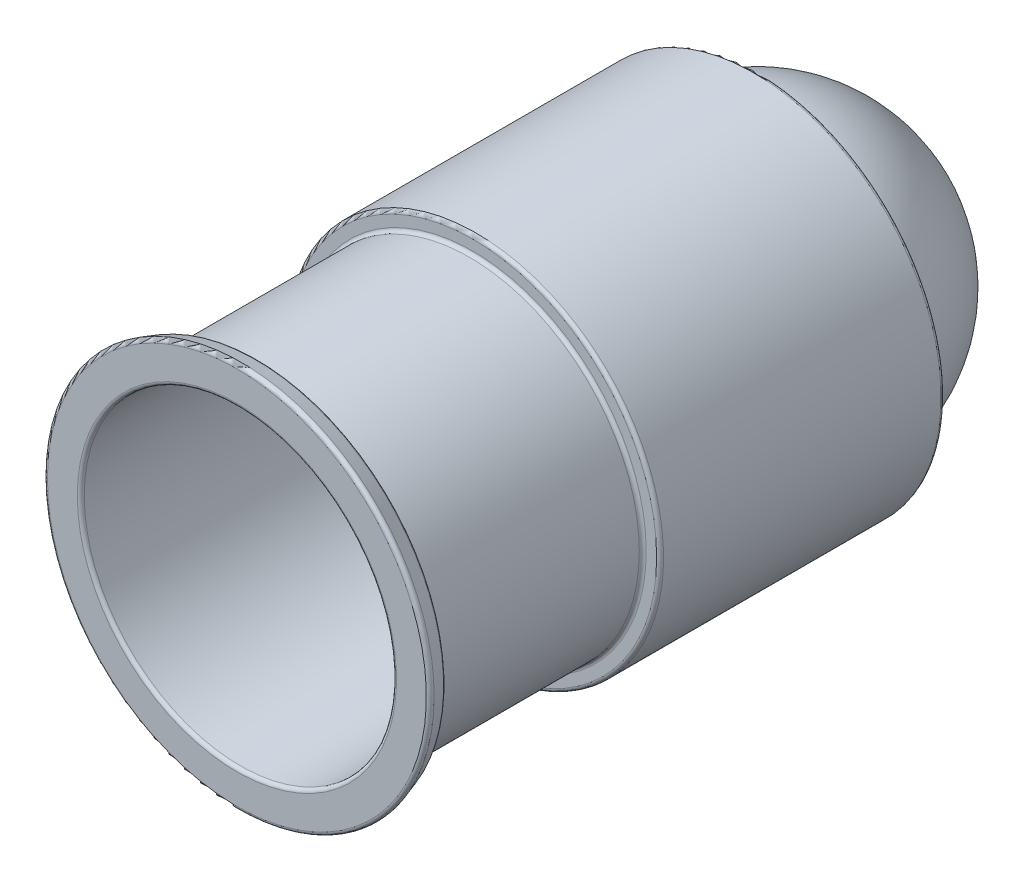
ISO-10303-21;
HEADER;
FILE_DESCRIPTION(('STEP AP214'),'2;1');
FILE_NAME('part.step','',(''),(''),'','','');
FILE_SCHEMA(('AUTOMOTIVE_DESIGN { 1 0 10303 214 1 1 1 1 }'));
ENDSEC;
DATA;
#1=APPLICATION_CONTEXT('core data for automotive mechanical design processes');
#2=APPLICATION_PROTOCOL_DEFINITION('international standard','automotive_design',2000,#1);
#3=PRODUCT_CONTEXT('',#1,'mechanical');
#4=PRODUCT('Part','Part','',(#3));
#5=PRODUCT_RELATED_PRODUCT_CATEGORY('part','',(#4));
#6=PRODUCT_DEFINITION_FORMATION('','',#4);
#7=PRODUCT_DEFINITION_CONTEXT('part definition',#1,'design');
#8=PRODUCT_DEFINITION('design','',#6,#7);
#9=PRODUCT_DEFINITION_SHAPE('','',#8);
#10=(LENGTH_UNIT() NAMED_UNIT(*) SI_UNIT(.MILLI.,.METRE.));
#11=(NAMED_UNIT(*) PLANE_ANGLE_UNIT() SI_UNIT($,.RADIAN.));
#12=(NAMED_UNIT(*) SI_UNIT($,.STERADIAN.) SOLID_ANGLE_UNIT());
#13=UNCERTAINTY_MEASURE_WITH_UNIT(LENGTH_MEASURE(1.E-05),#10,'distance_accuracy_value','');
#14=(GEOMETRIC_REPRESENTATION_CONTEXT(3) GLOBAL_UNCERTAINTY_ASSIGNED_CONTEXT((#13)) GLOBAL_UNIT_ASSIGNED_CONTEXT((#10,
#11,#12)) REPRESENTATION_CONTEXT('',''));
#15=CARTESIAN_POINT('',(0.,0.,0.));
#16=DIRECTION('',(0.,0.,1.));
#17=DIRECTION('',(1.,0.,0.));
#18=AXIS2_PLACEMENT_3D('',#15,#16,#17);
#19=CARTESIAN_POINT('',(27.,0.,-0.5));
#20=DIRECTION('',(0.,0.,-1.));
#21=DIRECTION('',(-1.,0.,0.));
#22=AXIS2_PLACEMENT_3D('',#19,#20,#21);
#23=TOROIDAL_SURFACE('',#22,23.,0.5);
#24=CARTESIAN_POINT('',(27.,0.,-0.5));
#25=DIRECTION('',(0.,0.,-1.));
#26=DIRECTION('',(-1.,0.,0.));
#27=AXIS2_PLACEMENT_3D('',#24,#25,#26);
#28=CIRCLE('',#27,22.5);
#29=CARTESIAN_POINT('',(4.50000000000001,0.,-0.5));
#30=VERTEX_POINT('',#29);
#31=EDGE_CURVE('E10',#30,#30,#28,.T.);
#32=ORIENTED_EDGE('',*,*,#31,.T.);
#33=EDGE_LOOP('',(#32));
#34=FACE_BOUND('',#33,.T.);
#35=CARTESIAN_POINT('',(27.,0.,0.));
#36=DIRECTION('',(0.,0.,-1.));
#37=DIRECTION('',(-1.,0.,0.));
#38=AXIS2_PLACEMENT_3D('',#35,#36,#37);
#39=CIRCLE('',#38,23.);
#40=CARTESIAN_POINT('',(4.00000000000001,0.,0.));
#41=VERTEX_POINT('',#40);
#42=EDGE_CURVE('E106',#41,#41,#39,.T.);
#43=ORIENTED_EDGE('',*,*,#42,.F.);
#44=EDGE_LOOP('',(#43));
#45=FACE_BOUND('',#44,.T.);
#46=ADVANCED_FACE('F30',(#34,#45),#23,.T.);
#47=CARTESIAN_POINT('',(27.,0.,-75.));
#48=DIRECTION('',(0.,0.,-1.));
#49=DIRECTION('',(-1.,0.,0.));
#50=AXIS2_PLACEMENT_3D('',#47,#48,#49);
#51=CYLINDRICAL_SURFACE('',#50,22.5);
#52=CARTESIAN_POINT('',(27.,0.,-72.));
#53=DIRECTION('',(0.,0.,-1.));
#54=DIRECTION('',(-1.,0.,0.));
#55=AXIS2_PLACEMENT_3D('',#52,#53,#54);
#56=CIRCLE('',#55,22.5);
#57=CARTESIAN_POINT('',(4.5,0.,-72.));
#58=VERTEX_POINT('',#57);
#59=EDGE_CURVE('E36',#58,#58,#56,.T.);
#60=ORIENTED_EDGE('',*,*,#59,.T.);
#61=EDGE_LOOP('',(#60));
#62=FACE_BOUND('',#61,.T.);
#63=ORIENTED_EDGE('',*,*,#31,.F.);
#64=EDGE_LOOP('',(#63));
#65=FACE_BOUND('',#64,.T.);
#66=ADVANCED_FACE('F114',(#62,#65),#51,.F.);
#67=CARTESIAN_POINT('',(27.,0.,-72.));
#68=DIRECTION('',(0.,0.,-1.));
#69=DIRECTION('',(-1.,0.,0.));
#70=AXIS2_PLACEMENT_3D('',#67,#68,#69);
#71=TOROIDAL_SURFACE('',#70,22.,0.5);
#72=CARTESIAN_POINT('',(27.,0.,-72.5));
#73=DIRECTION('',(0.,0.,-1.));
#74=DIRECTION('',(-1.,0.,0.));
#75=AXIS2_PLACEMENT_3D('',#72,#73,#74);
#76=CIRCLE('',#75,22.);
#77=CARTESIAN_POINT('',(5.,0.,-72.5));
#78=VERTEX_POINT('',#77);
#79=EDGE_CURVE('E40',#78,#78,#76,.T.);
#80=ORIENTED_EDGE('',*,*,#79,.T.);
#81=EDGE_LOOP('',(#80));
#82=FACE_BOUND('',#81,.T.);
#83=ORIENTED_EDGE('',*,*,#59,.F.);
#84=EDGE_LOOP('',(#83));
#85=FACE_BOUND('',#84,.T.);
#86=ADVANCED_FACE('F118',(#82,#85),#71,.F.);
#87=CARTESIAN_POINT('',(5.,0.,-72.5));
#88=DIRECTION('',(0.,0.,1.));
#89=DIRECTION('',(1.,0.,0.));
#90=AXIS2_PLACEMENT_3D('',#87,#88,#89);
#91=PLANE('',#90);
#92=CARTESIAN_POINT('',(27.,0.,-72.5));
#93=DIRECTION('',(0.,0.,-1.));
#94=DIRECTION('',(-1.,0.,0.));
#95=AXIS2_PLACEMENT_3D('',#92,#93,#94);
#96=CIRCLE('',#95,20.4022057631032);
#97=CARTESIAN_POINT('',(6.59779423689683,0.,-72.5));
#98=VERTEX_POINT('',#97);
#99=EDGE_CURVE('E44',#98,#98,#96,.T.);
#100=ORIENTED_EDGE('',*,*,#99,.T.);
#101=EDGE_LOOP('',(#100));
#102=FACE_BOUND('',#101,.T.);
#103=ORIENTED_EDGE('',*,*,#79,.F.);
#104=EDGE_LOOP('',(#103));
#105=FACE_BOUND('',#104,.T.);
#106=ADVANCED_FACE('F122',(#102,#105),#91,.T.);
#107=CARTESIAN_POINT('',(27.,0.,-73.));
#108=DIRECTION('',(0.,0.,-1.));
#109=DIRECTION('',(-1.,0.,0.));
#110=AXIS2_PLACEMENT_3D('',#107,#108,#109);
#111=TOROIDAL_SURFACE('',#110,20.4022057631032,0.499999999999999);
#112=CARTESIAN_POINT('',(27.,0.,-73.0487804878049));
#113=DIRECTION('',(0.,0.,-1.));
#114=DIRECTION('',(-1.,0.,0.));
#115=AXIS2_PLACEMENT_3D('',#112,#113,#114);
#116=CIRCLE('',#115,19.9045909883933);
#117=CARTESIAN_POINT('',(7.09540901160666,0.,-73.0487804878049));
#118=VERTEX_POINT('',#117);
#119=EDGE_CURVE('E49',#118,#118,#116,.T.);
#120=ORIENTED_EDGE('',*,*,#119,.T.);
#121=EDGE_LOOP('',(#120));
#122=FACE_BOUND('',#121,.T.);
#123=ORIENTED_EDGE('',*,*,#99,.F.);
#124=EDGE_LOOP('',(#123));
#125=FACE_BOUND('',#124,.T.);
#126=ADVANCED_FACE('F129',(#122,#125),#111,.T.);
#127=CARTESIAN_POINT('',(27.,0.,-75.));
#128=DIRECTION('',(0.,0.,-1.));
#129=DIRECTION('',(-1.,0.,0.));
#130=AXIS2_PLACEMENT_3D('',#127,#128,#129);
#131=SPHERICAL_SURFACE('',#130,20.);
#132=CARTESIAN_POINT('',(27.,0.,-90.8517822529482));
#133=DIRECTION('',(0.,0.,-1.));
#134=DIRECTION('',(-1.,0.,0.));
#135=AXIS2_PLACEMENT_3D('',#132,#133,#134);
#136=CIRCLE('',#135,12.1951219512195);
#137=CARTESIAN_POINT('',(14.8048780487805,0.,-90.8517822529482));
#138=VERTEX_POINT('',#137);
#139=EDGE_CURVE('E52',#138,#138,#136,.T.);
#140=CARTESIAN_POINT('',(14.8048780487805,0.,-90.8517822529482));
#141=CARTESIAN_POINT('',(14.6376476046658,0.,-90.7231297380726));
#142=CARTESIAN_POINT('',(14.4724545105892,0.,-90.5918290895563));
#143=CARTESIAN_POINT('',(14.1463051265668,0.,-90.324067107118));
#144=CARTESIAN_POINT('',(13.985348836621,0.,-90.1876057731961));
#145=CARTESIAN_POINT('',(13.667835164915,0.,-89.909658001823));
#146=CARTESIAN_POINT('',(13.5112777831548,0.,-89.7681715643718));
#147=CARTESIAN_POINT('',(13.2027184890873,0.,-89.4803155857149));
#148=CARTESIAN_POINT('',(13.0507165767801,0.,-89.3339460445091));
#149=CARTESIAN_POINT('',(12.7514205249749,0.,-89.0364703777392));
#150=CARTESIAN_POINT('',(12.604126385477,0.,-88.8853642521749));
#151=CARTESIAN_POINT('',(12.3143933858978,0.,-88.5785667794907));
#152=CARTESIAN_POINT('',(12.1719545258165,0.,-88.4228754323708));
#153=CARTESIAN_POINT('',(11.8920747506997,0.,-88.1070634451072));
#154=CARTESIAN_POINT('',(11.7546338356642,0.,-87.9469428049635));
#155=CARTESIAN_POINT('',(11.4848876046675,0.,-87.6224326035244));
#156=CARTESIAN_POINT('',(11.3525822887063,0.,-87.4580430422289));
#157=CARTESIAN_POINT('',(11.0932397678485,0.,-87.1251596440241));
#158=CARTESIAN_POINT('',(10.966202562952,0.,-86.9566658071148));
#159=CARTESIAN_POINT('',(10.7175234994659,0.,-86.6157426144095));
#160=CARTESIAN_POINT('',(10.5958816408764,0.,-86.4433132586135));
#161=CARTESIAN_POINT('',(10.3581151015987,0.,-86.0946917263814));
#162=CARTESIAN_POINT('',(10.2419904209105,0.,-85.9184995499452));
#163=CARTESIAN_POINT('',(10.0153745432172,0.,-85.5625288434051));
#164=CARTESIAN_POINT('',(9.90488334621196,0.,-85.3827503133012));
#165=CARTESIAN_POINT('',(9.68964509940458,0.,-85.0197869583351));
#166=CARTESIAN_POINT('',(9.58489804960242,0.,-84.8366021334729));
#167=CARTESIAN_POINT('',(9.38125300761332,0.,-84.4670096595096));
#168=CARTESIAN_POINT('',(9.28235501542638,0.,-84.2806020104084));
#169=CARTESIAN_POINT('',(9.09050714090073,0.,-83.9047505863363));
#170=CARTESIAN_POINT('',(8.99755725856201,0.,-83.7153068113654));
#171=CARTESIAN_POINT('',(8.81769869857916,0.,-83.3335728747839));
#172=CARTESIAN_POINT('',(8.73079002093502,0.,-83.1412827131735));
#173=CARTESIAN_POINT('',(8.5631009145612,0.,-82.7540485933692));
#174=CARTESIAN_POINT('',(8.48232048583152,0.,-82.5591046351753));
#175=CARTESIAN_POINT('',(8.32696878369997,0.,-82.1667581701959));
#176=CARTESIAN_POINT('',(8.2523975102981,0.,-81.9693556634102));
#177=CARTESIAN_POINT('',(8.10953880639653,0.,-81.5722898116216));
#178=CARTESIAN_POINT('',(8.04125137589682,0.,-81.3726264666187));
#179=CARTESIAN_POINT('',(7.91102875173051,0.,-80.9712389131341));
#180=CARTESIAN_POINT('',(7.84909355806391,0.,-80.7695147046525));
#181=CARTESIAN_POINT('',(7.73163743935194,0.,-80.364207463027));
#182=CARTESIAN_POINT('',(7.67611651430657,0.,-80.1606244298831));
#183=CARTESIAN_POINT('',(7.5715445403495,0.,-79.7518034394727));
#184=CARTESIAN_POINT('',(7.5224934914378,0.,-79.5465654822062));
#185=CARTESIAN_POINT('',(7.43091039730674,0.,-79.1346402015966));
#186=CARTESIAN_POINT('',(7.38837835208737,0.,-78.9279528782534));
#187=CARTESIAN_POINT('',(7.30987586368142,0.,-78.5133358751593));
#188=CARTESIAN_POINT('',(7.27390542049484,0.,-78.3054061954084));
#189=CARTESIAN_POINT('',(7.20856216283677,0.,-77.8885127334737));
#190=CARTESIAN_POINT('',(7.17918934836528,0.,-77.67954895129));
#191=CARTESIAN_POINT('',(7.12707076623962,0.,-77.2607965741359));
#192=CARTESIAN_POINT('',(7.10432499858546,0.,-77.0510079791655));
#193=CARTESIAN_POINT('',(7.06548329328399,0.,-76.630816092347));
#194=CARTESIAN_POINT('',(7.04938735563668,0.,-76.4204128004988));
#195=CARTESIAN_POINT('',(7.0238614241207,0.,-75.9992022508793));
#196=CARTESIAN_POINT('',(7.01443143025203,0.,-75.7883949931078));
#197=CARTESIAN_POINT('',(7.0022468581224,0.,-75.3665876494681));
#198=CARTESIAN_POINT('',(6.99949227986144,0.,-75.1555875635998));
#199=CARTESIAN_POINT('',(7.00066119657751,0.,-74.7336058862278));
#200=CARTESIAN_POINT('',(7.00458469155454,0.,-74.5226242947242));
#201=CARTESIAN_POINT('',(7.01910620298032,0.,-74.1008909417185));
#202=CARTESIAN_POINT('',(7.02970421942908,0.,-73.8901391802165));
#203=CARTESIAN_POINT('',(7.05756274910619,0.,-73.4690764743617));
#204=CARTESIAN_POINT('',(7.07482326233455,0.,-73.2587655300091));
#205=CARTESIAN_POINT('',(7.09540901160666,0.,-73.0487804878049));
#206=B_SPLINE_CURVE_WITH_KNOTS('',3,(#140,#141,#142,#143,#144,#145,#146,#147,#148,#149,#150,
#151,#152,#153,#154,#155,#156,#157,#158,#159,#160,#161,#162,#163,#164,#165,#166,#167,#168,#169,
#170,#171,#172,#173,#174,#175,#176,#177,#178,#179,#180,#181,#182,#183,#184,#185,#186,#187,#188,
#189,#190,#191,#192,#193,#194,#195,#196,#197,#198,#199,#200,#201,#202,#203,#204,#205),
.UNSPECIFIED.,.F.,.F.,(4,2,2,2,2,2,2,2,2,2,2,2,2,2,2,2,2,2,2,2,2,2,2,2,2,2,2,2,2,2,2,2,4),(0.,
0.632948526716031,1.26589705343205,1.89884558014808,2.53179410686412,3.16474263358014,
3.79769116029617,4.4306396870122,5.06358821372822,5.69653674044425,6.32948526716028,
6.96243379387631,7.59538232059234,8.22833084730836,8.86127937402438,9.49422790074041,
10.1271764274564,10.7601249541725,11.3930734808885,12.0260220076045,12.6589705343205,
13.2919190610366,13.9248675877526,14.5578161144686,15.1907646411847,15.8237131679007,
16.4566616946167,17.0896102213327,17.7225587480488,18.3555072747648,18.9884558014808,
19.6214043281969,20.2543528549129),.UNSPECIFIED.);
#207=EDGE_CURVE('BSEAM133',#138,#118,#206,.T.);
#208=ORIENTED_EDGE('',*,*,#139,.T.);
#209=ORIENTED_EDGE('',*,*,#119,.F.);
#210=ORIENTED_EDGE('',*,*,#207,.T.);
#211=ORIENTED_EDGE('',*,*,#207,.F.);
#212=EDGE_LOOP('',(#208,#210,#209,#211));
#213=FACE_BOUND('',#212,.T.);
#214=ADVANCED_FACE('F133',(#213),#131,.F.);
#215=CARTESIAN_POINT('',(27.,0.,-91.2480768092719));
#216=DIRECTION('',(0.,0.,-1.));
#217=DIRECTION('',(-1.,0.,0.));
#218=AXIS2_PLACEMENT_3D('',#215,#216,#217);
#219=TOROIDAL_SURFACE('',#218,12.5,0.499999999999997);
#220=CARTESIAN_POINT('',(27.,0.,-91.2480768092719));
#221=DIRECTION('',(0.,0.,-1.));
#222=DIRECTION('',(-1.,0.,0.));
#223=AXIS2_PLACEMENT_3D('',#220,#221,#222);
#224=CIRCLE('',#223,12.);
#225=CARTESIAN_POINT('',(15.,0.,-91.2480768092719));
#226=VERTEX_POINT('',#225);
#227=EDGE_CURVE('E55',#226,#226,#224,.T.);
#228=ORIENTED_EDGE('',*,*,#227,.T.);
#229=EDGE_LOOP('',(#228));
#230=FACE_BOUND('',#229,.T.);
#231=ORIENTED_EDGE('',*,*,#139,.F.);
#232=EDGE_LOOP('',(#231));
#233=FACE_BOUND('',#232,.T.);
#234=ADVANCED_FACE('F137',(#230,#233),#219,.T.);
#235=CARTESIAN_POINT('',(27.,0.,-75.));
#236=DIRECTION('',(0.,0.,-1.));
#237=DIRECTION('',(-1.,0.,0.));
#238=AXIS2_PLACEMENT_3D('',#235,#236,#237);
#239=CYLINDRICAL_SURFACE('',#238,12.);
#240=CARTESIAN_POINT('',(27.,0.,-93.1038669902317));
#241=DIRECTION('',(0.,0.,-1.));
#242=DIRECTION('',(-1.,0.,0.));
#243=AXIS2_PLACEMENT_3D('',#240,#241,#242);
#244=CIRCLE('',#243,12.);
#245=CARTESIAN_POINT('',(15.,0.,-93.1038669902317));
#246=VERTEX_POINT('',#245);
#247=EDGE_CURVE('E58',#246,#246,#244,.T.);
#248=ORIENTED_EDGE('',*,*,#247,.T.);
#249=EDGE_LOOP('',(#248));
#250=FACE_BOUND('',#249,.T.);
#251=ORIENTED_EDGE('',*,*,#227,.F.);
#252=EDGE_LOOP('',(#251));
#253=FACE_BOUND('',#252,.T.);
#254=ADVANCED_FACE('F141',(#250,#253),#239,.F.);
#255=CARTESIAN_POINT('',(27.,0.,-93.1038669902317));
#256=DIRECTION('',(0.,0.,-1.));
#257=DIRECTION('',(-1.,0.,0.));
#258=AXIS2_PLACEMENT_3D('',#255,#256,#257);
#259=TOROIDAL_SURFACE('',#258,12.5,0.500000000000001);
#260=CARTESIAN_POINT('',(27.,0.,-93.515318512737));
#261=DIRECTION('',(0.,0.,-1.));
#262=DIRECTION('',(-1.,0.,0.));
#263=AXIS2_PLACEMENT_3D('',#260,#261,#262);
#264=CIRCLE('',#263,12.7840909090909);
#265=CARTESIAN_POINT('',(14.2159090909091,0.,-93.515318512737));
#266=VERTEX_POINT('',#265);
#267=EDGE_CURVE('E61',#266,#266,#264,.T.);
#268=ORIENTED_EDGE('',*,*,#267,.T.);
#269=EDGE_LOOP('',(#268));
#270=FACE_BOUND('',#269,.T.);
#271=ORIENTED_EDGE('',*,*,#247,.F.);
#272=EDGE_LOOP('',(#271));
#273=FACE_BOUND('',#272,.T.);
#274=ADVANCED_FACE('F145',(#270,#273),#259,.T.);
#275=CARTESIAN_POINT('',(27.,0.,-75.));
#276=DIRECTION('',(0.,0.,-1.));
#277=DIRECTION('',(-1.,0.,0.));
#278=AXIS2_PLACEMENT_3D('',#275,#276,#277);
#279=SPHERICAL_SURFACE('',#278,22.5);
#280=CARTESIAN_POINT('',(27.,0.,-75.4891304347826));
#281=DIRECTION('',(0.,0.,-1.));
#282=DIRECTION('',(-1.,0.,0.));
#283=AXIS2_PLACEMENT_3D('',#280,#281,#282);
#284=CIRCLE('',#283,22.494682736544);
#285=CARTESIAN_POINT('',(4.50531726345602,0.,-75.4891304347826));
#286=VERTEX_POINT('',#285);
#287=EDGE_CURVE('E64',#286,#286,#284,.T.);
#288=CARTESIAN_POINT('',(4.50531726345602,0.,-75.4891304347826));
#289=CARTESIAN_POINT('',(4.51012990051532,0.,-75.7105064680877));
#290=CARTESIAN_POINT('',(4.51821247214517,0.,-75.9318113467285));
#291=CARTESIAN_POINT('',(4.54090595227022,0.,-76.3740861378272));
#292=CARTESIAN_POINT('',(4.55551686076542,0.,-76.5950560502851));
#293=CARTESIAN_POINT('',(4.59125548234546,0.,-77.0364682521639));
#294=CARTESIAN_POINT('',(4.61238319543029,0.,-77.2569105415847));
#295=CARTESIAN_POINT('',(4.66113668929271,0.,-77.6970753786347));
#296=CARTESIAN_POINT('',(4.68876247007028,0.,-77.9167979262638));
#297=CARTESIAN_POINT('',(4.7504881072967,0.,-78.3553317673341));
#298=CARTESIAN_POINT('',(4.78458796374554,0.,-78.5741430607752));
#299=CARTESIAN_POINT('',(4.85923200808944,0.,-79.0106636809299));
#300=CARTESIAN_POINT('',(4.89977619598451,0.,-79.2283730076434));
#301=CARTESIAN_POINT('',(4.98727357151208,0.,-79.6624999407614));
#302=CARTESIAN_POINT('',(5.03422675914458,0.,-79.8789175471659));
#303=CARTESIAN_POINT('',(5.13450120855924,0.,-80.3102724123379));
#304=CARTESIAN_POINT('',(5.18782247034139,0.,-80.5252096711054));
#305=CARTESIAN_POINT('',(5.30078659422393,0.,-80.953416503824));
#306=CARTESIAN_POINT('',(5.36042945632431,0.,-81.166686077775));
#307=CARTESIAN_POINT('',(5.48598479660425,0.,-81.591371657247));
#308=CARTESIAN_POINT('',(5.55189727478381,0.,-81.8027876627681));
#309=CARTESIAN_POINT('',(5.68993439859979,0.,-82.2235818373107));
#310=CARTESIAN_POINT('',(5.76205904423622,0.,-82.4329600063322));
#311=CARTESIAN_POINT('',(5.91245763984035,0.,-82.8494960159663));
#312=CARTESIAN_POINT('',(5.99073158980806,0.,-83.0566538565788));
#313=CARTESIAN_POINT('',(6.1533605712881,0.,-83.4685686527005));
#314=CARTESIAN_POINT('',(6.23771560280044,0.,-83.6733256082097));
#315=CARTESIAN_POINT('',(6.41243322437054,0.,-84.0802601700181));
#316=CARTESIAN_POINT('',(6.50279581442831,0.,-84.2824377763173));
#317=CARTESIAN_POINT('',(6.68944979396315,0.,-84.6840374237338));
#318=CARTESIAN_POINT('',(6.78574118344023,0.,-84.8834594648512));
#319=CARTESIAN_POINT('',(6.98416883520531,0.,-85.2793741676551));
#320=CARTESIAN_POINT('',(7.08630509749331,0.,-85.4758668293416));
#321=CARTESIAN_POINT('',(7.29633347393946,0.,-85.8657515122527));
#322=CARTESIAN_POINT('',(7.4042255880976,0.,-86.0591435334773));
#323=CARTESIAN_POINT('',(7.62567163060051,0.,-86.4426583769202));
#324=CARTESIAN_POINT('',(7.73922555894527,0.,-86.6327811991387));
#325=CARTESIAN_POINT('',(7.97189625735755,0.,-87.0095919354263));
#326=CARTESIAN_POINT('',(8.09101302742506,0.,-87.1962798494955));
#327=CARTESIAN_POINT('',(8.33470558830181,0.,-87.5660580541732));
#328=CARTESIAN_POINT('',(8.45928137911106,0.,-87.7491483447816));
#329=CARTESIAN_POINT('',(8.71378340246309,0.,-88.1115717228782));
#330=CARTESIAN_POINT('',(8.84370963500586,0.,-88.2909048103663));
#331=CARTESIAN_POINT('',(9.10879929942371,0.,-88.6456574773054));
#332=CARTESIAN_POINT('',(9.24396273129878,0.,-88.8210770567564));
#333=CARTESIAN_POINT('',(9.51940898729605,0.,-89.16784981367));
#334=CARTESIAN_POINT('',(9.65969181141826,0.,-89.3392029911326));
#335=CARTESIAN_POINT('',(9.94525458278974,0.,-89.6776935943862));
#336=CARTESIAN_POINT('',(10.090534530039,0.,-89.8448310201771));
#337=CARTESIAN_POINT('',(10.3859649231919,0.,-90.1747444446887));
#338=CARTESIAN_POINT('',(10.5361153690955,0.,-90.3375204434093));
#339=CARTESIAN_POINT('',(10.8411558896719,0.,-90.6585691402132));
#340=CARTESIAN_POINT('',(10.9960459643447,0.,-90.8168418382964));
#341=CARTESIAN_POINT('',(11.3104307428103,0.,-91.1287459835906));
#342=CARTESIAN_POINT('',(11.4699254466032,0.,-91.2823774308016));
#343=CARTESIAN_POINT('',(11.7933804656508,0.,-91.5848651757256));
#344=CARTESIAN_POINT('',(11.9573407809055,0.,-91.7337214734385));
#345=CARTESIAN_POINT('',(12.2895841304298,0.,-92.0265291590476));
#346=CARTESIAN_POINT('',(12.4578671646994,0.,-92.1704805469437));
#347=CARTESIAN_POINT('',(12.7986092272551,0.,-92.4533530159899));
#348=CARTESIAN_POINT('',(12.9710682555412,0.,-92.5922740971399));
#349=CARTESIAN_POINT('',(13.3200121836352,0.,-92.8649646105177));
#350=CARTESIAN_POINT('',(13.4964970834431,0.,-92.9987340427454));
#351=CARTESIAN_POINT('',(13.8533382190577,0.,-93.2610056363556));
#352=CARTESIAN_POINT('',(14.0336944548644,0.,-93.3895077977382));
#353=CARTESIAN_POINT('',(14.2159090909091,0.,-93.515318512737));
#354=B_SPLINE_CURVE_WITH_KNOTS('',3,(#288,#289,#290,#291,#292,#293,#294,#295,#296,#297,#298,
#299,#300,#301,#302,#303,#304,#305,#306,#307,#308,#309,#310,#311,#312,#313,#314,#315,#316,#317,
#318,#319,#320,#321,#322,#323,#324,#325,#326,#327,#328,#329,#330,#331,#332,#333,#334,#335,#336,
#337,#338,#339,#340,#341,#342,#343,#344,#345,#346,#347,#348,#349,#350,#351,#352,#353),
.UNSPECIFIED.,.F.,.F.,(4,2,2,2,2,2,2,2,2,2,2,2,2,2,2,2,2,2,2,2,2,2,2,2,2,2,2,2,2,2,2,2,4),(0.,
0.664260805290491,1.32852161058097,1.99278241587144,2.65704322116191,3.3213040264524,
3.98556483174288,4.64982563703335,5.31408644232383,5.97834724761432,6.64260805290479,
7.30686885819527,7.97112966348575,8.63539046877623,9.2996512740667,9.96391207935718,
10.6281728846477,11.2924336899381,11.9566944952286,12.6209553005191,13.2852161058096,
13.9494769111001,14.6137377163905,15.277998521681,15.9422593269715,16.606520132262,
17.2707809375524,17.9350417428429,18.5993025481334,19.2635633534239,19.9278241587144,
20.5920849640048,21.2563457692953),.UNSPECIFIED.);
#355=EDGE_CURVE('BSEAM149',#286,#266,#354,.T.);
#356=ORIENTED_EDGE('',*,*,#287,.T.);
#357=ORIENTED_EDGE('',*,*,#267,.F.);
#358=ORIENTED_EDGE('',*,*,#355,.T.);
#359=ORIENTED_EDGE('',*,*,#355,.F.);
#360=EDGE_LOOP('',(#356,#358,#357,#359));
#361=FACE_BOUND('',#360,.T.);
#362=ADVANCED_FACE('F149',(#361),#279,.T.);
#363=CARTESIAN_POINT('',(27.,0.,-75.5));
#364=DIRECTION('',(0.,0.,-1.));
#365=DIRECTION('',(-1.,0.,0.));
#366=AXIS2_PLACEMENT_3D('',#363,#364,#365);
#367=TOROIDAL_SURFACE('',#366,22.9945645751338,0.5);
#368=CARTESIAN_POINT('',(27.,0.,-75.));
#369=DIRECTION('',(0.,0.,-1.));
#370=DIRECTION('',(-1.,0.,0.));
#371=AXIS2_PLACEMENT_3D('',#368,#369,#370);
#372=CIRCLE('',#371,22.9945645751338);
#373=CARTESIAN_POINT('',(4.00543542486616,0.,-75.));
#374=VERTEX_POINT('',#373);
#375=EDGE_CURVE('E67',#374,#374,#372,.T.);
#376=ORIENTED_EDGE('',*,*,#375,.T.);
#377=EDGE_LOOP('',(#376));
#378=FACE_BOUND('',#377,.T.);
#379=ORIENTED_EDGE('',*,*,#287,.F.);
#380=EDGE_LOOP('',(#379));
#381=FACE_BOUND('',#380,.T.);
#382=ADVANCED_FACE('F153',(#378,#381),#367,.F.);
#383=CARTESIAN_POINT('',(0.500000000000003,0.,-75.));
#384=DIRECTION('',(0.,0.,-1.));
#385=DIRECTION('',(-1.,0.,0.));
#386=AXIS2_PLACEMENT_3D('',#383,#384,#385);
#387=PLANE('',#386);
#388=CARTESIAN_POINT('',(27.,0.,-75.));
#389=DIRECTION('',(0.,0.,-1.));
#390=DIRECTION('',(-1.,0.,0.));
#391=AXIS2_PLACEMENT_3D('',#388,#389,#390);
#392=CIRCLE('',#391,26.5);
#393=CARTESIAN_POINT('',(0.500000000000004,0.,-75.));
#394=VERTEX_POINT('',#393);
#395=EDGE_CURVE('E70',#394,#394,#392,.T.);
#396=ORIENTED_EDGE('',*,*,#395,.T.);
#397=EDGE_LOOP('',(#396));
#398=FACE_BOUND('',#397,.T.);
#399=ORIENTED_EDGE('',*,*,#375,.F.);
#400=EDGE_LOOP('',(#399));
#401=FACE_BOUND('',#400,.T.);
#402=ADVANCED_FACE('F157',(#398,#401),#387,.T.);
#403=CARTESIAN_POINT('',(27.,0.,-74.5));
#404=DIRECTION('',(0.,0.,-1.));
#405=DIRECTION('',(-1.,0.,0.));
#406=AXIS2_PLACEMENT_3D('',#403,#404,#405);
#407=TOROIDAL_SURFACE('',#406,26.5,0.5);
#408=CARTESIAN_POINT('',(27.,0.,-74.5));
#409=DIRECTION('',(0.,0.,-1.));
#410=DIRECTION('',(-1.,0.,0.));
#411=AXIS2_PLACEMENT_3D('',#408,#409,#410);
#412=CIRCLE('',#411,27.);
#413=CARTESIAN_POINT('',(0.,0.,-74.5));
#414=VERTEX_POINT('',#413);
#415=EDGE_CURVE('E73',#414,#414,#412,.T.);
#416=ORIENTED_EDGE('',*,*,#415,.T.);
#417=EDGE_LOOP('',(#416));
#418=FACE_BOUND('',#417,.T.);
#419=ORIENTED_EDGE('',*,*,#395,.F.);
#420=EDGE_LOOP('',(#419));
#421=FACE_BOUND('',#420,.T.);
#422=ADVANCED_FACE('F161',(#418,#421),#407,.T.);
#423=CARTESIAN_POINT('',(27.,0.,-75.));
#424=DIRECTION('',(0.,0.,-1.));
#425=DIRECTION('',(-1.,0.,0.));
#426=AXIS2_PLACEMENT_3D('',#423,#424,#425);
#427=CYLINDRICAL_SURFACE('',#426,27.);
#428=CARTESIAN_POINT('',(27.,0.,-34.5));
#429=DIRECTION('',(0.,0.,-1.));
#430=DIRECTION('',(-1.,0.,0.));
#431=AXIS2_PLACEMENT_3D('',#428,#429,#430);
#432=CIRCLE('',#431,27.);
#433=CARTESIAN_POINT('',(0.,0.,-34.5));
#434=VERTEX_POINT('',#433);
#435=EDGE_CURVE('E76',#434,#434,#432,.T.);
#436=ORIENTED_EDGE('',*,*,#435,.T.);
#437=EDGE_LOOP('',(#436));
#438=FACE_BOUND('',#437,.T.);
#439=ORIENTED_EDGE('',*,*,#415,.F.);
#440=EDGE_LOOP('',(#439));
#441=FACE_BOUND('',#440,.T.);
#442=ADVANCED_FACE('F165',(#438,#441),#427,.T.);
#443=CARTESIAN_POINT('',(27.,0.,-34.5));
#444=DIRECTION('',(0.,0.,-1.));
#445=DIRECTION('',(-1.,0.,0.));
#446=AXIS2_PLACEMENT_3D('',#443,#444,#445);
#447=TOROIDAL_SURFACE('',#446,26.5,0.5);
#448=CARTESIAN_POINT('',(27.,0.,-34.));
#449=DIRECTION('',(0.,0.,-1.));
#450=DIRECTION('',(-1.,0.,0.));
#451=AXIS2_PLACEMENT_3D('',#448,#449,#450);
#452=CIRCLE('',#451,26.5);
#453=CARTESIAN_POINT('',(0.500000000000004,0.,-34.));
#454=VERTEX_POINT('',#453);
#455=EDGE_CURVE('E79',#454,#454,#452,.T.);
#456=ORIENTED_EDGE('',*,*,#455,.T.);
#457=EDGE_LOOP('',(#456));
#458=FACE_BOUND('',#457,.T.);
#459=ORIENTED_EDGE('',*,*,#435,.F.);
#460=EDGE_LOOP('',(#459));
#461=FACE_BOUND('',#460,.T.);
#462=ADVANCED_FACE('F169',(#458,#461),#447,.T.);
#463=CARTESIAN_POINT('',(2.,0.,-34.));
#464=DIRECTION('',(0.,0.,1.));
#465=DIRECTION('',(1.,0.,0.));
#466=AXIS2_PLACEMENT_3D('',#463,#464,#465);
#467=PLANE('',#466);
#468=CARTESIAN_POINT('',(27.,0.,-34.));
#469=DIRECTION('',(0.,0.,-1.));
#470=DIRECTION('',(-1.,0.,0.));
#471=AXIS2_PLACEMENT_3D('',#468,#469,#470);
#472=CIRCLE('',#471,25.);
#473=CARTESIAN_POINT('',(2.,0.,-34.));
#474=VERTEX_POINT('',#473);
#475=EDGE_CURVE('E82',#474,#474,#472,.T.);
#476=ORIENTED_EDGE('',*,*,#475,.T.);
#477=EDGE_LOOP('',(#476));
#478=FACE_BOUND('',#477,.T.);
#479=ORIENTED_EDGE('',*,*,#455,.F.);
#480=EDGE_LOOP('',(#479));
#481=FACE_BOUND('',#480,.T.);
#482=ADVANCED_FACE('F173',(#478,#481),#467,.T.);
#483=CARTESIAN_POINT('',(27.,0.,-33.5));
#484=DIRECTION('',(0.,0.,-1.));
#485=DIRECTION('',(-1.,0.,0.));
#486=AXIS2_PLACEMENT_3D('',#483,#484,#485);
#487=TOROIDAL_SURFACE('',#486,25.,0.5);
#488=CARTESIAN_POINT('',(27.,0.,-33.5));
#489=DIRECTION('',(0.,0.,-1.));
#490=DIRECTION('',(-1.,0.,0.));
#491=AXIS2_PLACEMENT_3D('',#488,#489,#490);
#492=CIRCLE('',#491,24.5);
#493=CARTESIAN_POINT('',(2.5,0.,-33.5));
#494=VERTEX_POINT('',#493);
#495=EDGE_CURVE('E85',#494,#494,#492,.T.);
#496=ORIENTED_EDGE('',*,*,#495,.T.);
#497=EDGE_LOOP('',(#496));
#498=FACE_BOUND('',#497,.T.);
#499=ORIENTED_EDGE('',*,*,#475,.F.);
#500=EDGE_LOOP('',(#499));
#501=FACE_BOUND('',#500,.T.);
#502=ADVANCED_FACE('F177',(#498,#501),#487,.F.);
#503=CARTESIAN_POINT('',(27.,0.,-75.));
#504=DIRECTION('',(0.,0.,-1.));
#505=DIRECTION('',(-1.,0.,0.));
#506=AXIS2_PLACEMENT_3D('',#503,#504,#505);
#507=CYLINDRICAL_SURFACE('',#506,24.5);
#508=CARTESIAN_POINT('',(27.,0.,-3.5));
#509=DIRECTION('',(0.,0.,-1.));
#510=DIRECTION('',(-1.,0.,0.));
#511=AXIS2_PLACEMENT_3D('',#508,#509,#510);
#512=CIRCLE('',#511,24.5);
#513=CARTESIAN_POINT('',(2.5,0.,-3.5));
#514=VERTEX_POINT('',#513);
#515=EDGE_CURVE('E88',#514,#514,#512,.T.);
#516=ORIENTED_EDGE('',*,*,#515,.T.);
#517=EDGE_LOOP('',(#516));
#518=FACE_BOUND('',#517,.T.);
#519=ORIENTED_EDGE('',*,*,#495,.F.);
#520=EDGE_LOOP('',(#519));
#521=FACE_BOUND('',#520,.T.);
#522=ADVANCED_FACE('F181',(#518,#521),#507,.T.);
#523=CARTESIAN_POINT('',(27.,0.,-3.5));
#524=DIRECTION('',(0.,0.,-1.));
#525=DIRECTION('',(-1.,0.,0.));
#526=AXIS2_PLACEMENT_3D('',#523,#524,#525);
#527=TOROIDAL_SURFACE('',#526,25.,0.5);
#528=CARTESIAN_POINT('',(27.,0.,-3.));
#529=DIRECTION('',(0.,0.,-1.));
#530=DIRECTION('',(-1.,0.,0.));
#531=AXIS2_PLACEMENT_3D('',#528,#529,#530);
#532=CIRCLE('',#531,25.);
#533=CARTESIAN_POINT('',(2.,0.,-3.));
#534=VERTEX_POINT('',#533);
#535=EDGE_CURVE('E91',#534,#534,#532,.T.);
#536=ORIENTED_EDGE('',*,*,#535,.T.);
#537=EDGE_LOOP('',(#536));
#538=FACE_BOUND('',#537,.T.);
#539=ORIENTED_EDGE('',*,*,#515,.F.);
#540=EDGE_LOOP('',(#539));
#541=FACE_BOUND('',#540,.T.);
#542=ADVANCED_FACE('F185',(#538,#541),#527,.F.);
#543=CARTESIAN_POINT('',(0.360379610028066,0.,-3.));
#544=DIRECTION('',(0.,0.,-1.));
#545=DIRECTION('',(-1.,0.,0.));
#546=AXIS2_PLACEMENT_3D('',#543,#544,#545);
#547=PLANE('',#546);
#548=CARTESIAN_POINT('',(27.,0.,-3.));
#549=DIRECTION('',(0.,0.,-1.));
#550=DIRECTION('',(-1.,0.,0.));
#551=AXIS2_PLACEMENT_3D('',#548,#549,#550);
#552=CIRCLE('',#551,26.6396203899719);
#553=CARTESIAN_POINT('',(0.360379610028067,0.,-3.));
#554=VERTEX_POINT('',#553);
#555=EDGE_CURVE('E94',#554,#554,#552,.T.);
#556=ORIENTED_EDGE('',*,*,#555,.T.);
#557=EDGE_LOOP('',(#556));
#558=FACE_BOUND('',#557,.T.);
#559=ORIENTED_EDGE('',*,*,#535,.F.);
#560=EDGE_LOOP('',(#559));
#561=FACE_BOUND('',#560,.T.);
#562=ADVANCED_FACE('F189',(#558,#561),#547,.T.);
#563=CARTESIAN_POINT('',(27.,0.,-2.5));
#564=DIRECTION('',(0.,0.,-1.));
#565=DIRECTION('',(-1.,0.,0.));
#566=AXIS2_PLACEMENT_3D('',#563,#564,#565);
#567=TOROIDAL_SURFACE('',#566,26.6396203899719,0.5);
#568=CARTESIAN_POINT('',(27.,0.,-2.65811388300842));
#569=DIRECTION('',(0.,0.,-1.));
#570=DIRECTION('',(-1.,0.,0.));
#571=AXIS2_PLACEMENT_3D('',#568,#569,#570);
#572=CIRCLE('',#571,27.1139620389972);
#573=CARTESIAN_POINT('',(-0.113962038997193,0.,-2.65811388300842));
#574=VERTEX_POINT('',#573);
#575=EDGE_CURVE('E97',#574,#574,#572,.T.);
#576=ORIENTED_EDGE('',*,*,#575,.T.);
#577=EDGE_LOOP('',(#576));
#578=FACE_BOUND('',#577,.T.);
#579=ORIENTED_EDGE('',*,*,#555,.F.);
#580=EDGE_LOOP('',(#579));
#581=FACE_BOUND('',#580,.T.);
#582=ADVANCED_FACE('F193',(#578,#581),#567,.T.);
#583=CARTESIAN_POINT('',(27.,0.,-2.65811388300842));
#584=DIRECTION('',(0.,0.,1.));
#585=DIRECTION('',(1.,0.,0.));
#586=AXIS2_PLACEMENT_3D('',#583,#584,#585);
#587=CONICAL_SURFACE('',#586,27.1139620389972,0.321750554396642);
#588=CARTESIAN_POINT('',(27.,0.,-0.658113883008418));
#589=DIRECTION('',(0.,0.,-1.));
#590=DIRECTION('',(-1.,0.,0.));
#591=AXIS2_PLACEMENT_3D('',#588,#589,#590);
#592=CIRCLE('',#591,27.7806287056639);
#593=CARTESIAN_POINT('',(-0.780628705663859,0.,-0.658113883008418));
#594=VERTEX_POINT('',#593);
#595=EDGE_CURVE('E100',#594,#594,#592,.T.);
#596=ORIENTED_EDGE('',*,*,#595,.T.);
#597=EDGE_LOOP('',(#596));
#598=FACE_BOUND('',#597,.T.);
#599=ORIENTED_EDGE('',*,*,#575,.F.);
#600=EDGE_LOOP('',(#599));
#601=FACE_BOUND('',#600,.T.);
#602=ADVANCED_FACE('F197',(#598,#601),#587,.T.);
#603=CARTESIAN_POINT('',(27.,0.,-0.499999999999999));
#604=DIRECTION('',(0.,0.,-1.));
#605=DIRECTION('',(-1.,0.,0.));
#606=AXIS2_PLACEMENT_3D('',#603,#604,#605);
#607=TOROIDAL_SURFACE('',#606,27.3062870566386,0.5);
#608=CARTESIAN_POINT('',(27.,0.,0.));
#609=DIRECTION('',(0.,0.,-1.));
#610=DIRECTION('',(-1.,0.,0.));
#611=AXIS2_PLACEMENT_3D('',#608,#609,#610);
#612=CIRCLE('',#611,27.3062870566386);
#613=CARTESIAN_POINT('',(-0.306287056638599,0.,0.));
#614=VERTEX_POINT('',#613);
#615=EDGE_CURVE('E103',#614,#614,#612,.T.);
#616=ORIENTED_EDGE('',*,*,#615,.T.);
#617=EDGE_LOOP('',(#616));
#618=FACE_BOUND('',#617,.T.);
#619=ORIENTED_EDGE('',*,*,#595,.F.);
#620=EDGE_LOOP('',(#619));
#621=FACE_BOUND('',#620,.T.);
#622=ADVANCED_FACE('F201',(#618,#621),#607,.T.);
#623=CARTESIAN_POINT('',(4.00000000000001,0.,0.));
#624=DIRECTION('',(0.,0.,1.));
#625=DIRECTION('',(1.,0.,0.));
#626=AXIS2_PLACEMENT_3D('',#623,#624,#625);
#627=PLANE('',#626);
#628=ORIENTED_EDGE('',*,*,#42,.T.);
#629=EDGE_LOOP('',(#628));
#630=FACE_BOUND('',#629,.T.);
#631=ORIENTED_EDGE('',*,*,#615,.F.);
#632=EDGE_LOOP('',(#631));
#633=FACE_BOUND('',#632,.T.);
#634=ADVANCED_FACE('F110',(#630,#633),#627,.T.);
#635=CLOSED_SHELL('',(#46,#66,#86,#106,#126,#214,#234,#254,#274,#362,#382,#402,#422,#442,#462,
#482,#502,#522,#542,#562,#582,#602,#622,#634));
#636=MANIFOLD_SOLID_BREP('B2',#635);
#637=ADVANCED_BREP_SHAPE_REPRESENTATION('',(#18,#636),#14);
#638=SHAPE_DEFINITION_REPRESENTATION(#9,#637);
ENDSEC;
END-ISO-10303-21;
